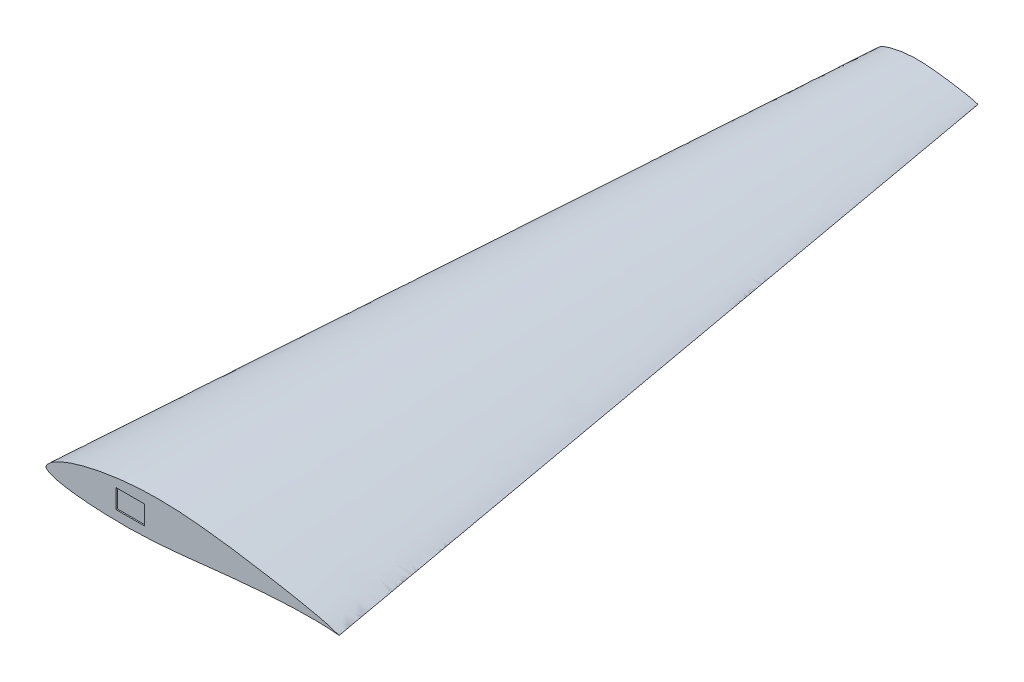
ISO-10303-21;
HEADER;
FILE_DESCRIPTION(('STEP AP214'),'2;1');
FILE_NAME('part.step','',(''),(''),'','','');
FILE_SCHEMA(('AUTOMOTIVE_DESIGN { 1 0 10303 214 1 1 1 1 }'));
ENDSEC;
DATA;
#1=APPLICATION_CONTEXT('core data for automotive mechanical design processes');
#2=APPLICATION_PROTOCOL_DEFINITION('international standard','automotive_design',2000,#1);
#3=PRODUCT_CONTEXT('',#1,'mechanical');
#4=PRODUCT('Part','Part','',(#3));
#5=PRODUCT_RELATED_PRODUCT_CATEGORY('part','',(#4));
#6=PRODUCT_DEFINITION_FORMATION('','',#4);
#7=PRODUCT_DEFINITION_CONTEXT('part definition',#1,'design');
#8=PRODUCT_DEFINITION('design','',#6,#7);
#9=PRODUCT_DEFINITION_SHAPE('','',#8);
#10=(LENGTH_UNIT() NAMED_UNIT(*) SI_UNIT(.MILLI.,.METRE.));
#11=(NAMED_UNIT(*) PLANE_ANGLE_UNIT() SI_UNIT($,.RADIAN.));
#12=(NAMED_UNIT(*) SI_UNIT($,.STERADIAN.) SOLID_ANGLE_UNIT());
#13=UNCERTAINTY_MEASURE_WITH_UNIT(LENGTH_MEASURE(1.E-05),#10,'distance_accuracy_value','');
#14=(GEOMETRIC_REPRESENTATION_CONTEXT(3) GLOBAL_UNCERTAINTY_ASSIGNED_CONTEXT((#13)) GLOBAL_UNIT_ASSIGNED_CONTEXT((#10,
#11,#12)) REPRESENTATION_CONTEXT('',''));
#15=CARTESIAN_POINT('',(0.,0.,0.));
#16=DIRECTION('',(0.,0.,1.));
#17=DIRECTION('',(1.,0.,0.));
#18=AXIS2_PLACEMENT_3D('',#15,#16,#17);
#19=CARTESIAN_POINT('',(-1152.13318667176,-13.10991310776,-20.));
#20=DIRECTION('',(0.,0.,1.));
#21=DIRECTION('',(-1.,0.,0.));
#22=AXIS2_PLACEMENT_3D('',#19,#20,#21);
#23=PLANE('',#22);
#24=CARTESIAN_POINT('',(1167.2058981927,-30.8287655417814,-20.));
#25=CARTESIAN_POINT('',(1167.20094205409,-30.6125348061449,-20.));
#26=CARTESIAN_POINT('',(1150.55812547847,-26.2222684266974,-20.));
#27=CARTESIAN_POINT('',(1134.82540200827,-19.935632175429,-20.));
#28=CARTESIAN_POINT('',(1098.6120870386,-7.58308667640115,-20.));
#29=CARTESIAN_POINT('',(1055.10846288295,5.30202759492293,-20.));
#30=CARTESIAN_POINT('',(998.763315338816,18.7180818982876,-20.));
#31=CARTESIAN_POINT('',(932.135509290922,33.1471605686924,-20.));
#32=CARTESIAN_POINT('',(855.136774910614,48.7571140419909,-20.));
#33=CARTESIAN_POINT('',(769.160433794038,65.3150377322802,-20.));
#34=CARTESIAN_POINT('',(675.329726698728,82.5389939377325,-20.));
#35=CARTESIAN_POINT('',(574.985519526962,100.129820104777,-20.));
#36=CARTESIAN_POINT('',(469.432133283733,117.589571827369,-20.));
#37=CARTESIAN_POINT('',(360.059319501105,134.510811557431,-20.));
#38=CARTESIAN_POINT('',(248.195538752362,150.341358991376,-20.));
#39=CARTESIAN_POINT('',(135.170092557183,164.471008346329,-20.));
#40=CARTESIAN_POINT('',(22.2510450991397,176.387001607296,-20.));
#41=CARTESIAN_POINT('',(-89.4773105438022,185.36142647281,-20.));
#42=CARTESIAN_POINT('',(-199.198140394845,190.447965807139,-20.));
#43=CARTESIAN_POINT('',(-306.290633386234,191.360736000371,-20.));
#44=CARTESIAN_POINT('',(-410.303508399844,187.860956850583,-20.));
#45=CARTESIAN_POINT('',(-510.728758861772,180.174517107883,-20.));
#46=CARTESIAN_POINT('',(-606.924129786052,169.079400162372,-20.));
#47=CARTESIAN_POINT('',(-698.060056527238,155.258673151785,-20.));
#48=CARTESIAN_POINT('',(-783.165410093493,138.967899254407,-20.));
#49=CARTESIAN_POINT('',(-861.372011698718,120.724870890821,-20.));
#50=CARTESIAN_POINT('',(-931.876852978271,100.923653640039,-20.));
#51=CARTESIAN_POINT('',(-993.926503002303,80.0008743940595,-20.));
#52=CARTESIAN_POINT('',(-1046.91523960918,58.4337335558672,-20.));
#53=CARTESIAN_POINT('',(-1090.33210191695,36.5317821888165,-20.));
#54=CARTESIAN_POINT('',(-1123.8026712494,14.8406154016031,-20.));
#55=CARTESIAN_POINT('',(-1143.08475254185,-2.09839090037191,-20.));
#56=CARTESIAN_POINT('',(-1153.7633419372,-14.9763351096262,-20.));
#57=CARTESIAN_POINT('',(-1158.68703654053,-22.3942325025825,-20.));
#58=CARTESIAN_POINT('',(-1162.00980127258,-30.3470028754014,-20.));
#59=CARTESIAN_POINT('',(-1162.96321031832,-35.2319349474596,-20.));
#60=CARTESIAN_POINT('',(-1162.78139542472,-38.6557944007734,-20.));
#61=CARTESIAN_POINT('',(-1161.40716590262,-41.8760675021992,-20.));
#62=CARTESIAN_POINT('',(-1158.19651173585,-46.0146296484932,-20.));
#63=CARTESIAN_POINT('',(-1151.34910308779,-52.3047930563116,-20.));
#64=CARTESIAN_POINT('',(-1137.77118638329,-61.0452534655465,-20.));
#65=CARTESIAN_POINT('',(-1112.70761372977,-72.0855309303668,-20.));
#66=CARTESIAN_POINT('',(-1074.56858735021,-83.6296075048392,-20.));
#67=CARTESIAN_POINT('',(-1023.37735058653,-94.5175934332822,-20.));
#68=CARTESIAN_POINT('',(-961.357944689747,-103.965687711033,-20.));
#69=CARTESIAN_POINT('',(-889.205864982308,-112.148705326003,-20.));
#70=CARTESIAN_POINT('',(-807.781230762513,-118.864291993696,-20.));
#71=CARTESIAN_POINT('',(-718.123012274133,-123.92113901691,-20.));
#72=CARTESIAN_POINT('',(-621.353030363154,-127.121085721016,-20.));
#73=CARTESIAN_POINT('',(-518.513635114154,-128.000687141774,-20.));
#74=CARTESIAN_POINT('',(-410.4965568004,-125.92739470241,-20.));
#75=CARTESIAN_POINT('',(-297.931780603609,-120.499713058915,-20.));
#76=CARTESIAN_POINT('',(-181.192228331441,-111.413060940735,-20.));
#77=CARTESIAN_POINT('',(-60.6773192350566,-99.1751483002546,-20.));
#78=CARTESIAN_POINT('',(62.9269886556645,-85.6192218943303,-20.));
#79=CARTESIAN_POINT('',(188.252653618113,-71.7895767046168,-20.));
#80=CARTESIAN_POINT('',(313.535108762903,-58.6199136567897,-20.));
#81=CARTESIAN_POINT('',(436.892194820228,-46.7059926617858,-20.));
#82=CARTESIAN_POINT('',(556.377817264392,-36.7171224297439,-20.));
#83=CARTESIAN_POINT('',(670.014090312546,-28.9740748515905,-20.));
#84=CARTESIAN_POINT('',(775.805069390217,-23.5991733728416,-20.));
#85=CARTESIAN_POINT('',(871.995923235459,-20.7419146039119,-20.));
#86=CARTESIAN_POINT('',(956.449753180622,-19.9967327290336,-20.));
#87=CARTESIAN_POINT('',(1028.67553891412,-21.2747573154828,-20.));
#88=CARTESIAN_POINT('',(1084.37445965471,-23.2358309601832,-20.));
#89=CARTESIAN_POINT('',(1129.92046876616,-26.8606596821739,-20.));
#90=CARTESIAN_POINT('',(1148.77840735508,-27.9769839768032,-20.));
#91=CARTESIAN_POINT('',(1167.21101773133,-31.0521252358525,-20.));
#92=CARTESIAN_POINT('',(1167.2058981927,-30.8287655417814,-20.));
#93=B_SPLINE_CURVE_WITH_KNOTS('',3,(#24,#25,#26,#27,#28,#29,#30,#31,#32,#33,#34,#35,#36,#37,#38,
#39,#40,#41,#42,#43,#44,#45,#46,#47,#48,#49,#50,#51,#52,#53,#54,#55,#56,#57,#58,#59,#60,#61,#62,
#63,#64,#65,#66,#67,#68,#69,#70,#71,#72,#73,#74,#75,#76,#77,#78,#79,#80,#81,#82,#83,#84,#85,#86,
#87,#88,#89,#90,#91,#92),.UNSPECIFIED.,.T.,.F.,(4,1,1,1,1,1,1,1,1,1,1,1,1,1,1,1,1,1,1,1,1,1,1,1,
1,1,1,1,1,1,1,1,1,1,1,1,1,1,1,1,1,1,1,1,1,1,1,1,1,1,1,1,1,1,1,1,1,1,1,1,1,1,1,1,1,1,4),(0.,
0.00178025429931348,0.00677661855276226,0.014307631931115,0.0240462466109695,0.0361164032384218,
0.0505469730630571,0.0671298835400742,0.0856244289456062,0.10576729194862,0.127282098412942,
0.149864114045041,0.173229760189317,0.197069077892929,0.221103034083199,0.245051957369849,
0.268663179942347,0.291772797822348,0.314298508345449,0.336177511433891,0.357377359215959,
0.377791670496789,0.397224888102935,0.415489312865215,0.432417328029751,0.447849235180273,
0.461650757544391,0.473686992386839,0.483898395757803,0.492262508108233,0.498796820958936,
0.499955027372734,0.502810607326279,0.504371243067385,0.50535998755193,0.505924933279694,
0.506503368203689,0.507535007041587,0.509204749770686,0.512345281497249,0.517665407870953,
0.526421681932562,0.537424925562334,0.550643204547595,0.565965823835836,0.583206168779579,
0.6021549785986,0.622586582637333,0.644254823208852,0.666997978581174,0.690702845759673,
0.715307475272001,0.740824202204505,0.767084355637659,0.793717038600972,0.82033109971691,
0.846519300878587,0.871863223081629,0.895937170924907,0.918334876492831,0.938667169413558,
0.956573464196435,0.971715275283217,0.983839006179547,0.992717916559063,0.998161052107173,1.),.UNSPECIFIED.);
#94=CARTESIAN_POINT('',(1167.2058981927,-30.8287655417814,-20.));
#95=VERTEX_POINT('',#94);
#96=EDGE_CURVE('E63',#95,#95,#93,.T.);
#97=ORIENTED_EDGE('',*,*,#96,.T.);
#98=EDGE_LOOP('',(#97));
#99=FACE_BOUND('',#98,.T.);
#100=DIRECTION('',(-1.,0.,0.));
#101=VECTOR('',#100,1.);
#102=CARTESIAN_POINT('',(-378.662123766315,-50.9305698518282,-20.));
#103=LINE('',#102,#101);
#104=CARTESIAN_POINT('',(-378.662123766315,-50.9305698518282,-20.));
#105=VERTEX_POINT('',#104);
#106=CARTESIAN_POINT('',(-605.033690274723,-50.9305698518282,-20.));
#107=VERTEX_POINT('',#106);
#108=EDGE_CURVE('E101',#105,#107,#103,.T.);
#109=ORIENTED_EDGE('',*,*,#108,.T.);
#110=DIRECTION('',(0.,1.,0.));
#111=VECTOR('',#110,1.);
#112=CARTESIAN_POINT('',(-605.033690274723,100.87153945381,-20.));
#113=LINE('',#112,#111);
#114=CARTESIAN_POINT('',(-605.033690274723,100.87153945381,-20.));
#115=VERTEX_POINT('',#114);
#116=EDGE_CURVE('E78',#107,#115,#113,.T.);
#117=ORIENTED_EDGE('',*,*,#116,.T.);
#118=DIRECTION('',(1.,0.,0.));
#119=VECTOR('',#118,1.);
#120=CARTESIAN_POINT('',(-378.662123766315,100.87153945381,-20.));
#121=LINE('',#120,#119);
#122=CARTESIAN_POINT('',(-378.662123766315,100.87153945381,-20.));
#123=VERTEX_POINT('',#122);
#124=EDGE_CURVE('E141',#115,#123,#121,.T.);
#125=ORIENTED_EDGE('',*,*,#124,.T.);
#126=DIRECTION('',(0.,-1.,0.));
#127=VECTOR('',#126,1.);
#128=CARTESIAN_POINT('',(-378.662123766315,100.87153945381,-20.));
#129=LINE('',#128,#127);
#130=EDGE_CURVE('E129',#123,#105,#129,.T.);
#131=ORIENTED_EDGE('',*,*,#130,.T.);
#132=EDGE_LOOP('',(#109,#117,#125,#131));
#133=FACE_BOUND('',#132,.T.);
#134=ADVANCED_FACE('F50',(#99,#133),#23,.T.);
#135=CARTESIAN_POINT('',(-747.653077521207,-40.6182657315667,-6220.));
#136=DIRECTION('',(0.,0.,1.));
#137=DIRECTION('',(-1.,0.,0.));
#138=AXIS2_PLACEMENT_3D('',#135,#136,#137);
#139=PLANE('',#138);
#140=CARTESIAN_POINT('',(46.231204019507,-35.2354448345607,-6220.));
#141=CARTESIAN_POINT('',(46.2284405656363,-35.161464044046,-6220.));
#142=CARTESIAN_POINT('',(40.5107466597847,-33.7410304315181,-6220.));
#143=CARTESIAN_POINT('',(35.095173755005,-31.6670699807893,-6220.));
#144=CARTESIAN_POINT('',(22.6401533138637,-27.6181263346662,-6220.));
#145=CARTESIAN_POINT('',(7.68738653694873,-23.4228917248776,-6220.));
#146=CARTESIAN_POINT('',(-11.6630288456523,-19.1093216631822,-6220.));
#147=CARTESIAN_POINT('',(-34.5376973183015,-14.4997928532483,-6220.));
#148=CARTESIAN_POINT('',(-60.9676577726097,-9.5372939208794,-6220.));
#149=CARTESIAN_POINT('',(-90.4748945702333,-4.29466001199642,-6220.));
#150=CARTESIAN_POINT('',(-122.673585589033,1.13715909285272,-6220.));
#151=CARTESIAN_POINT('',(-157.103341203516,6.66239247620247,-6220.));
#152=CARTESIAN_POINT('',(-193.315298237174,12.1170555043395,-6220.));
#153=CARTESIAN_POINT('',(-230.831801501577,17.3685612770775,-6220.));
#154=CARTESIAN_POINT('',(-269.195458339637,22.2344819950382,-6220.));
#155=CARTESIAN_POINT('',(-307.948301893932,26.5125347132972,-6220.));
#156=CARTESIAN_POINT('',(-346.653804819708,30.0334858752315,-6220.));
#157=CARTESIAN_POINT('',(-384.937273776908,32.5535580846316,-6220.));
#158=CARTESIAN_POINT('',(-422.514475712798,33.7529045585345,-6220.));
#159=CARTESIAN_POINT('',(-459.17152624748,33.5367452774346,-6220.));
#160=CARTESIAN_POINT('',(-494.752795326995,31.8255847079449,-6220.));
#161=CARTESIAN_POINT('',(-529.085531914352,28.6992408412461,-6220.));
#162=CARTESIAN_POINT('',(-561.953763146873,24.4271493642645,-6220.));
#163=CARTESIAN_POINT('',(-593.076940726259,19.2471852213284,-6220.));
#164=CARTESIAN_POINT('',(-622.123955821754,13.2516082607377,-6220.));
#165=CARTESIAN_POINT('',(-648.800228679982,6.62191851956731,-6220.));
#166=CARTESIAN_POINT('',(-672.832873554333,-0.503051287442359,-6220.));
#167=CARTESIAN_POINT('',(-693.96618270177,-7.97014647053786,-6220.));
#168=CARTESIAN_POINT('',(-711.995202148996,-15.6130550209624,-6220.));
#169=CARTESIAN_POINT('',(-726.74658265942,-23.3233108305785,-6220.));
#170=CARTESIAN_POINT('',(-738.094871742379,-30.9123353139702,-6220.));
#171=CARTESIAN_POINT('',(-744.610586604553,-36.8048992419908,-6220.));
#172=CARTESIAN_POINT('',(-748.201788544685,-41.2650967461758,-6220.));
#173=CARTESIAN_POINT('',(-749.850318344285,-43.828182757875,-6220.));
#174=CARTESIAN_POINT('',(-750.94828793429,-46.5664283398626,-6220.));
#175=CARTESIAN_POINT('',(-751.250483793828,-48.2430082792743,-6220.));
#176=CARTESIAN_POINT('',(-751.171358916499,-49.4139312981977,-6220.));
#177=CARTESIAN_POINT('',(-750.685133378202,-50.5092914480428,-6220.));
#178=CARTESIAN_POINT('',(-749.565856882824,-51.9098735302076,-6220.));
#179=CARTESIAN_POINT('',(-747.191277168439,-54.0288947151431,-6220.));
#180=CARTESIAN_POINT('',(-742.501078818877,-56.9533147580623,-6220.));
#181=CARTESIAN_POINT('',(-733.868548954772,-60.6081626209987,-6220.));
#182=CARTESIAN_POINT('',(-720.75844147582,-64.3709023541952,-6220.));
#183=CARTESIAN_POINT('',(-703.184436093652,-67.8446748921428,-6220.));
#184=CARTESIAN_POINT('',(-681.911582287878,-70.772200095514,-6220.));
#185=CARTESIAN_POINT('',(-657.177051439535,-73.2167412462913,-6220.));
#186=CARTESIAN_POINT('',(-629.276219223052,-75.1132874538173,-6220.));
#187=CARTESIAN_POINT('',(-598.56561876685,-76.4014909147392,-6220.));
#188=CARTESIAN_POINT('',(-565.43017274413,-77.0190676374616,-6220.));
#189=CARTESIAN_POINT('',(-530.228914169513,-76.8125475071701,-6220.));
#190=CARTESIAN_POINT('',(-493.270160843118,-75.5698410912889,-6220.));
#191=CARTESIAN_POINT('',(-454.771507600199,-73.1566453823038,-6220.));
#192=CARTESIAN_POINT('',(-414.862090680234,-69.4705576020164,-6220.));
#193=CARTESIAN_POINT('',(-373.676106035862,-64.6873134822189,-6220.));
#194=CARTESIAN_POINT('',(-331.439275690689,-59.4377296716919,-6220.));
#195=CARTESIAN_POINT('',(-288.614659582081,-54.0859694749774,-6220.));
#196=CARTESIAN_POINT('',(-245.801574741511,-48.9603022904963,-6220.));
#197=CARTESIAN_POINT('',(-203.641252257449,-44.2739171415237,-6220.));
#198=CARTESIAN_POINT('',(-162.796442142331,-40.2654907769843,-6220.));
#199=CARTESIAN_POINT('',(-123.942495214821,-37.0545696704387,-6220.));
#200=CARTESIAN_POINT('',(-87.7619223828843,-34.6928701852552,-6220.));
#201=CARTESIAN_POINT('',(-54.8545790950461,-33.2402187187982,-6220.));
#202=CARTESIAN_POINT('',(-25.9538233844276,-32.5683565258773,-6220.));
#203=CARTESIAN_POINT('',(-1.22814621466564,-32.6492910205264,-6220.));
#204=CARTESIAN_POINT('',(17.844561028956,-33.0455684548176,-6220.));
#205=CARTESIAN_POINT('',(33.4506324915198,-34.0613780335465,-6220.));
#206=CARTESIAN_POINT('',(39.9102962245878,-34.3503679361492,-6220.));
#207=CARTESIAN_POINT('',(46.2340585822929,-35.311864713945,-6220.));
#208=CARTESIAN_POINT('',(46.231204019507,-35.2354448345607,-6220.));
#209=B_SPLINE_CURVE_WITH_KNOTS('',3,(#140,#141,#142,#143,#144,#145,#146,#147,#148,#149,#150,
#151,#152,#153,#154,#155,#156,#157,#158,#159,#160,#161,#162,#163,#164,#165,#166,#167,#168,#169,
#170,#171,#172,#173,#174,#175,#176,#177,#178,#179,#180,#181,#182,#183,#184,#185,#186,#187,#188,
#189,#190,#191,#192,#193,#194,#195,#196,#197,#198,#199,#200,#201,#202,#203,#204,#205,#206,#207,
#208),.UNSPECIFIED.,.T.,.F.,(4,1,1,1,1,1,1,1,1,1,1,1,1,1,1,1,1,1,1,1,1,1,1,1,1,1,1,1,1,1,1,1,1,
1,1,1,1,1,1,1,1,1,1,1,1,1,1,1,1,1,1,1,1,1,1,1,1,1,1,1,1,1,1,1,1,1,4),(0.,0.00178025429931348,
0.00677661855276226,0.014307631931115,0.0240462466109695,0.0361164032384218,0.0505469730630571,
0.0671298835400742,0.0856244289456062,0.10576729194862,0.127282098412942,0.149864114045041,
0.173229760189317,0.197069077892929,0.221103034083199,0.245051957369849,0.268663179942347,
0.291772797822348,0.314298508345449,0.336177511433891,0.357377359215959,0.377791670496789,
0.397224888102935,0.415489312865215,0.432417328029751,0.447849235180273,0.461650757544391,
0.473686992386839,0.483898395757803,0.492262508108233,0.498796820958936,0.499955027372734,
0.502810607326279,0.504371243067385,0.50535998755193,0.505924933279694,0.506503368203689,
0.507535007041587,0.509204749770686,0.512345281497249,0.517665407870953,0.526421681932562,
0.537424925562334,0.550643204547595,0.565965823835836,0.583206168779579,0.6021549785986,
0.622586582637333,0.644254823208852,0.666997978581174,0.690702845759673,0.715307475272001,
0.740824202204505,0.767084355637659,0.793717038600972,0.82033109971691,0.846519300878587,
0.871863223081629,0.895937170924907,0.918334876492831,0.938667169413558,0.956573464196435,
0.971715275283217,0.983839006179547,0.992717916559063,0.998161052107173,1.),.UNSPECIFIED.);
#210=CARTESIAN_POINT('',(46.231204019507,-35.2354448345607,-6220.));
#211=VERTEX_POINT('',#210);
#212=EDGE_CURVE('E12',#211,#211,#209,.T.);
#213=ORIENTED_EDGE('',*,*,#212,.F.);
#214=EDGE_LOOP('',(#213));
#215=FACE_BOUND('',#214,.T.);
#216=ADVANCED_FACE('F52',(#215),#139,.F.);
#217=CARTESIAN_POINT('',(-1162.80093681062,-35.1631921790562,-20.));
#218=CARTESIAN_POINT('',(-751.127407137551,-47.6464509229914,-6220.));
#219=CARTESIAN_POINT('',(-1162.82218379801,-35.4148684875712,-20.));
#220=CARTESIAN_POINT('',(-751.14142513213,-47.7317010378396,-6220.));
#221=CARTESIAN_POINT('',(-1162.87189893173,-36.2284220161607,-20.));
#222=CARTESIAN_POINT('',(-751.181479745274,-48.0073492187059,-6220.));
#223=CARTESIAN_POINT('',(-1162.84876824659,-37.3870585535843,-20.));
#224=CARTESIAN_POINT('',(-751.212003010877,-48.4002126372902,-6220.));
#225=CARTESIAN_POINT('',(-1162.61538645023,-38.8260829593911,-20.));
#226=CARTESIAN_POINT('',(-751.205936581557,-48.9022365528266,-6220.));
#227=CARTESIAN_POINT('',(-1162.20122176191,-40.0153326805554,-20.));
#228=CARTESIAN_POINT('',(-751.149350948429,-49.3294659917411,-6220.));
#229=CARTESIAN_POINT('',(-1161.5415607564,-41.3501189108856,-20.));
#230=CARTESIAN_POINT('',(-750.994737816625,-49.8118201361654,-6220.));
#231=CARTESIAN_POINT('',(-1160.49507255786,-43.0517640407889,-20.));
#232=CARTESIAN_POINT('',(-750.693102250106,-50.4312829941758,-6220.));
#233=CARTESIAN_POINT('',(-1159.10433634,-44.7657984056075,-20.));
#234=CARTESIAN_POINT('',(-750.256246487288,-51.0459696479064,-6220.));
#235=CARTESIAN_POINT('',(-1156.5731933585,-47.5058416355701,-20.));
#236=CARTESIAN_POINT('',(-749.416488376659,-52.0107554517047,-6220.));
#237=CARTESIAN_POINT('',(-1154.1769500547,-49.6523307730814,-20.));
#238=CARTESIAN_POINT('',(-748.611427802237,-52.7615844367858,-6220.));
#239=CARTESIAN_POINT('',(-1148.6375824423,-54.0502698747751,-20.));
#240=CARTESIAN_POINT('',(-746.730863479948,-54.2879264972246,-6220.));
#241=CARTESIAN_POINT('',(-1143.93790078237,-57.0324125459158,-20.));
#242=CARTESIAN_POINT('',(-745.127778881206,-55.3155216976197,-6220.));
#243=CARTESIAN_POINT('',(-1132.68502689756,-63.2856607980921,-20.));
#244=CARTESIAN_POINT('',(-741.271616253597,-57.4518931681089,-6220.));
#245=CARTESIAN_POINT('',(-1124.41666857986,-66.8979562011114,-20.));
#246=CARTESIAN_POINT('',(-738.436071417425,-58.6743610617412,-6220.));
#247=CARTESIAN_POINT('',(-1104.0799315644,-74.6969930737921,-20.));
#248=CARTESIAN_POINT('',(-731.452005928495,-61.2861024299933,-6220.));
#249=CARTESIAN_POINT('',(-1090.22169978196,-78.8689057909252,-20.));
#250=CARTESIAN_POINT('',(-726.694952758834,-62.6670607253582,-6220.));
#251=CARTESIAN_POINT('',(-1060.4278402018,-86.6372366559048,-20.));
#252=CARTESIAN_POINT('',(-716.466679165266,-65.2097515079323,-6220.));
#253=CARTESIAN_POINT('',(-1042.79647444445,-90.3716143825966,-20.));
#254=CARTESIAN_POINT('',(-710.416790483915,-66.4150887779212,-6220.));
#255=CARTESIAN_POINT('',(-1005.56620474238,-97.230960043249,-20.));
#256=CARTESIAN_POINT('',(-697.644342595635,-68.6007561784582,-6220.));
#257=CARTESIAN_POINT('',(-984.279801732776,-100.463443592199,-20.));
#258=CARTESIAN_POINT('',(-690.344479221008,-69.6116826334672,-6220.));
#259=CARTESIAN_POINT('',(-939.968877173729,-106.391496044778,-20.));
#260=CARTESIAN_POINT('',(-675.151371615518,-71.4362702565338,-6220.));
#261=CARTESIAN_POINT('',(-915.262534533087,-109.185210548054,-20.));
#262=CARTESIAN_POINT('',(-666.682488130611,-72.2773083825788,-6220.));
#263=CARTESIAN_POINT('',(-864.426937652912,-114.192374734008,-20.));
#264=CARTESIAN_POINT('',(-649.260178746018,-73.7517046735597,-6220.));
#265=CARTESIAN_POINT('',(-836.616183644671,-116.479005488935,-20.));
#266=CARTESIAN_POINT('',(-639.73101548564,-74.4026274975686,-6220.));
#267=CARTESIAN_POINT('',(-779.921918043632,-120.435595606086,-20.));
#268=CARTESIAN_POINT('',(-620.308326956115,-75.486802895482,-6220.));
#269=CARTESIAN_POINT('',(-749.356989548695,-122.153094567043,-20.));
#270=CARTESIAN_POINT('',(-609.839170905086,-75.9286043978483,-6220.));
#271=CARTESIAN_POINT('',(-687.526671639854,-124.932885195187,-20.));
#272=CARTESIAN_POINT('',(-588.664210241904,-76.5836753733088,-6220.));
#273=CARTESIAN_POINT('',(-654.579763498405,-126.015577223397,-20.));
#274=CARTESIAN_POINT('',(-577.382832209052,-76.7962945908848,-6220.));
#275=CARTESIAN_POINT('',(-588.388676330774,-127.40303499319,-20.));
#276=CARTESIAN_POINT('',(-554.722067026049,-76.9537868757262,-6220.));
#277=CARTESIAN_POINT('',(-553.463082381829,-127.694050613575,-20.));
#278=CARTESIAN_POINT('',(-542.767268643542,-76.8861080190515,-6220.));
#279=CARTESIAN_POINT('',(-483.592413040276,-127.330405119437,-20.));
#280=CARTESIAN_POINT('',(-518.85553536317,-76.4273586963049,-6220.));
#281=CARTESIAN_POINT('',(-446.966886676244,-126.619332334349,-20.));
#282=CARTESIAN_POINT('',(-506.323726287629,-76.00875604561,-6220.));
#283=CARTESIAN_POINT('',(-373.906113490436,-124.163065893781,-20.));
#284=CARTESIAN_POINT('',(-481.330177815911,-74.8185266368609,-6220.));
#285=CARTESIAN_POINT('',(-335.792606005059,-122.317057011245,-20.));
#286=CARTESIAN_POINT('',(-468.294534369807,-74.0043038696539,-6220.));
#287=CARTESIAN_POINT('',(-259.889195452736,-117.538593796299,-20.));
#288=CARTESIAN_POINT('',(-442.339202583138,-72.0054456539621,-6220.));
#289=CARTESIAN_POINT('',(-220.424449688419,-114.460196449742,-20.));
#290=CARTESIAN_POINT('',(-428.847066353092,-70.7622288894901,-6220.));
#291=CARTESIAN_POINT('',(-141.813544032135,-107.414278533103,-20.));
#292=CARTESIAN_POINT('',(-401.976193920792,-67.9716757541424,-6220.));
#293=CARTESIAN_POINT('',(-100.995999182059,-103.26712330858,-20.));
#294=CARTESIAN_POINT('',(-388.026457907883,-66.3539298518788,-6220.));
#295=CARTESIAN_POINT('',(-19.8959729918267,-94.7025782269162,-20.));
#296=CARTESIAN_POINT('',(-360.311756195002,-63.0254702980006,-6220.));
#297=CARTESIAN_POINT('',(22.0572868382875,-90.1012921926885,-20.));
#298=CARTESIAN_POINT('',(-345.97580160877,-61.2444635221544,-6220.));
#299=CARTESIAN_POINT('',(104.877431201199,-80.9900045976973,-20.));
#300=CARTESIAN_POINT('',(-317.67543865908,-57.7176072400212,-6220.));
#301=CARTESIAN_POINT('',(147.415245349056,-76.2974479994419,-20.));
#302=CARTESIAN_POINT('',(-303.140030241952,-55.9011941659093,-6220.));
#303=CARTESIAN_POINT('',(230.814160738487,-67.3155208048084,-20.));
#304=CARTESIAN_POINT('',(-274.641213520155,-52.4135466090698,-6220.));
#305=CARTESIAN_POINT('',(273.34654561888,-62.8469584398096,-20.));
#306=CARTESIAN_POINT('',(-260.106661836917,-50.6729356073692,-6220.));
#307=CARTESIAN_POINT('',(356.10424868016,-54.5085538151363,-20.));
#308=CARTESIAN_POINT('',(-231.824260001459,-47.4074556833747,-6220.));
#309=CARTESIAN_POINT('',(398.001483145769,-50.4658204194294,-20.));
#310=CARTESIAN_POINT('',(-217.505056961184,-45.8149662759653,-6220.));
#311=CARTESIAN_POINT('',(478.837616492646,-43.1994002756613,-20.));
#312=CARTESIAN_POINT('',(-189.875157787999,-42.9241781081205,-6220.));
#313=CARTESIAN_POINT('',(519.449125211496,-39.808815896065,-20.));
#314=CARTESIAN_POINT('',(-175.992823604059,-41.5605567405333,-6220.));
#315=CARTESIAN_POINT('',(597.039432074497,-33.9464858219613,-20.));
#316=CARTESIAN_POINT('',(-149.466929054913,-39.1653912946596,-6220.));
#317=CARTESIAN_POINT('',(635.691758147447,-31.3178571213149,-20.));
#318=CARTESIAN_POINT('',(-136.251337683896,-38.0717822114152,-6220.));
#319=CARTESIAN_POINT('',(708.697181241306,-27.0087106546781,-20.));
#320=CARTESIAN_POINT('',(-111.286803426713,-36.2300900327708,-6220.));
#321=CARTESIAN_POINT('',(744.726286704508,-25.1844843466594,-20.));
#322=CARTESIAN_POINT('',(-98.9651052741872,-35.4241618480409,-6220.));
#323=CARTESIAN_POINT('',(811.896313393692,-22.5271169424411,-20.));
#324=CARTESIAN_POINT('',(-75.9899672258875,-34.1751701427918,-6220.));
#325=CARTESIAN_POINT('',(844.710262781509,-21.5587233449551,-20.));
#326=CARTESIAN_POINT('',(-64.7640727036485,-33.6776603042969,-6220.));
#327=CARTESIAN_POINT('',(904.722881392011,-20.4531469298585,-20.));
#328=CARTESIAN_POINT('',(-44.2292297655829,-32.9951221570591,-6220.));
#329=CARTESIAN_POINT('',(933.614915270421,-20.2064937713281,-20.));
#330=CARTESIAN_POINT('',(-34.3430563613789,-32.763382860872,-6220.));
#331=CARTESIAN_POINT('',(985.645245963093,-20.5133426517996,-20.));
#332=CARTESIAN_POINT('',(-16.5382582317236,-32.6015550028647,-6220.));
#333=CARTESIAN_POINT('',(1010.40894688517,-20.9569515974464,-20.));
#334=CARTESIAN_POINT('',(-8.05769346037086,-32.6269358813236,-6220.));
#335=CARTESIAN_POINT('',(1052.55365181706,-22.1154690793108,-20.));
#336=CARTESIAN_POINT('',(6.38583708555751,-32.8090373118029,-6220.));
#337=CARTESIAN_POINT('',(1071.81891508838,-22.8098110488612,-20.));
#338=CARTESIAN_POINT('',(12.9729042702342,-32.9443490727743,-6220.));
#339=CARTESIAN_POINT('',(1105.86292841497,-24.9460141413969,-20.));
#340=CARTESIAN_POINT('',(24.5916797934128,-33.4883744378349,-6220.));
#341=CARTESIAN_POINT('',(1121.63655147603,-26.1959565127779,-20.));
#342=CARTESIAN_POINT('',(30.03006042549,-33.8387307210732,-6220.));
#343=CARTESIAN_POINT('',(1140.69335667294,-27.4983771313504,-20.));
#344=CARTESIAN_POINT('',(36.6899311496249,-34.2045790935945,-6220.));
#345=CARTESIAN_POINT('',(1147.84079960988,-27.9981008544572,-20.));
#346=CARTESIAN_POINT('',(39.0340366974602,-34.3111661810945,-6220.));
#347=CARTESIAN_POINT('',(1163.45052073251,-30.42475563168,-20.));
#348=CARTESIAN_POINT('',(44.0733446394874,-34.9879008816027,-6220.));
#349=CARTESIAN_POINT('',(1167.93232742973,-31.1215007100377,-20.));
#350=CARTESIAN_POINT('',(45.9272473515707,-35.2652155843534,-6220.));
#351=CARTESIAN_POINT('',(1166.33325094202,-30.3836435544886,-20.));
#352=CARTESIAN_POINT('',(46.4680358961861,-35.2384187687712,-6220.));
#353=CARTESIAN_POINT('',(1161.2442722409,-29.024594269748,-20.));
#354=CARTESIAN_POINT('',(45.0244696021425,-34.8623642927802,-6220.));
#355=CARTESIAN_POINT('',(1148.2120545959,-25.2848023683636,-20.));
#356=CARTESIAN_POINT('',(40.2341206243334,-33.6034333426219,-6220.));
#357=CARTESIAN_POINT('',(1142.25005771613,-22.916800229585,-20.));
#358=CARTESIAN_POINT('',(38.0794627096275,-32.8099402503357,-6220.));
#359=CARTESIAN_POINT('',(1126.12472065244,-16.96778561373,-20.));
#360=CARTESIAN_POINT('',(32.6553805949656,-30.8788003993694,-6220.));
#361=CARTESIAN_POINT('',(1113.32486640781,-12.6124338111884,-20.));
#362=CARTESIAN_POINT('',(28.2853129879629,-29.453284574816,-6220.));
#363=CARTESIAN_POINT('',(1086.92159636149,-4.1205404820076,-20.));
#364=CARTESIAN_POINT('',(19.1724246219445,-26.6503419030121,-6220.));
#365=CARTESIAN_POINT('',(1071.94600026188,0.300240411527605,-20.));
#366=CARTESIAN_POINT('',(14.0188966510992,-25.1992967714753,-6220.));
#367=CARTESIAN_POINT('',(1039.41748291533,9.03812641609774,-20.));
#368=CARTESIAN_POINT('',(2.85974978337416,-22.3526340151024,-6220.));
#369=CARTESIAN_POINT('',(1020.10278709425,13.6315317362294,-20.));
#370=CARTESIAN_POINT('',(-3.76900719014392,-20.8690469613892,-6220.));
#371=CARTESIAN_POINT('',(979.550729393399,22.878805933971,-20.));
#372=CARTESIAN_POINT('',(-17.6957510629968,-17.8959063334472,-6220.));
#373=CARTESIAN_POINT('',(956.686338927663,27.8267503564571,-20.));
#374=CARTESIAN_POINT('',(-25.5456443902167,-16.3118028101146,-6220.));
#375=CARTESIAN_POINT('',(909.142474659076,37.8085384952476,-20.));
#376=CARTESIAN_POINT('',(-41.8648224263828,-13.1254579178056,-6220.));
#377=CARTESIAN_POINT('',(882.801663806097,43.1459171622422,-20.));
#378=CARTESIAN_POINT('',(-50.9056937233297,-11.4265319293285,-6220.));
#379=CARTESIAN_POINT('',(828.767605392938,53.8354727041483,-20.));
#380=CARTESIAN_POINT('',(-69.4513275639072,-8.03099873418249,-6220.));
#381=CARTESIAN_POINT('',(799.421575983434,59.4847100989811,-20.));
#382=CARTESIAN_POINT('',(-79.5226702293248,-6.24057257240141,-6220.));
#383=CARTESIAN_POINT('',(739.759899581921,70.7119224980746,-20.));
#384=CARTESIAN_POINT('',(-99.9967162284235,-2.68925721914329,-6220.));
#385=CARTESIAN_POINT('',(707.787802745408,76.5786113767624,-20.));
#386=CARTESIAN_POINT('',(-110.967871891671,-0.837558427809834,-6220.));
#387=CARTESIAN_POINT('',(643.314129890749,88.1514833275713,-20.));
#388=CARTESIAN_POINT('',(-133.090718616217,2.8080684098029,-6220.));
#389=CARTESIAN_POINT('',(609.155063789181,94.1370211815367,-20.));
#390=CARTESIAN_POINT('',(-144.81097819915,4.6897332684965,-6220.));
#391=CARTESIAN_POINT('',(540.770148942646,105.789438396151,-20.));
#392=CARTESIAN_POINT('',(-168.272744518702,8.34388715992015,-6220.));
#393=CARTESIAN_POINT('',(504.884536405658,111.722376626192,-20.));
#394=CARTESIAN_POINT('',(-180.583631154224,10.1992648237815,-6220.));
#395=CARTESIAN_POINT('',(433.487022724113,123.150696314042,-20.));
#396=CARTESIAN_POINT('',(-205.075357182463,13.762168612102,-6220.));
#397=CARTESIAN_POINT('',(396.313239717191,128.898232320554,-20.));
#398=CARTESIAN_POINT('',(-217.82618550289,15.5480539922229,-6220.));
#399=CARTESIAN_POINT('',(322.814345929599,139.781582104013,-20.));
#400=CARTESIAN_POINT('',(-243.034336984895,18.9150117197281,-6220.));
#401=CARTESIAN_POINT('',(284.824972878614,145.153060385565,-20.));
#402=CARTESIAN_POINT('',(-256.062404549643,20.5687284200707,-6220.));
#403=CARTESIAN_POINT('',(210.123992235666,155.100796983355,-20.));
#404=CARTESIAN_POINT('',(-281.67727664949,23.6107968641405,-6220.));
#405=CARTESIAN_POINT('',(171.745512805084,159.893086791191,-20.));
#406=CARTESIAN_POINT('',(-294.835635649197,25.0649847446526,-6220.));
#407=CARTESIAN_POINT('',(96.70621955741,168.529980342407,-20.));
#408=CARTESIAN_POINT('',(-320.55981726333,27.6578998973982,-6220.));
#409=CARTESIAN_POINT('',(58.3757788906826,172.567678134436,-20.));
#410=CARTESIAN_POINT('',(-333.698000986181,28.8549260035531,-6220.));
#411=CARTESIAN_POINT('',(-16.1705938703289,179.473166351753,-20.));
#412=CARTESIAN_POINT('',(-359.244905506049,30.8598960825497,-6220.));
#413=CARTESIAN_POINT('',(-54.058965393001,182.506744355249,-20.));
#414=CARTESIAN_POINT('',(-372.226857307811,31.7168740487757,-6220.));
#415=CARTESIAN_POINT('',(-127.448992254084,187.121752683177,-20.));
#416=CARTESIAN_POINT('',(-397.366811804777,32.9470106612055,-6220.));
#417=CARTESIAN_POINT('',(-164.626196780766,188.834346007167,-20.));
#418=CARTESIAN_POINT('',(-410.098991871917,33.356641239308,-6220.));
#419=CARTESIAN_POINT('',(-236.415468718096,190.765176351186,-20.));
#420=CARTESIAN_POINT('',(-434.678287394496,33.6775423486159,-6220.));
#421=CARTESIAN_POINT('',(-272.706452706908,191.062320543712,-20.));
#422=CARTESIAN_POINT('',(-447.100446371808,33.6079260164729,-6220.));
#423=CARTESIAN_POINT('',(-342.564213532085,190.140218641669,-20.));
#424=CARTESIAN_POINT('',(-471.005220483377,32.9635913100783,-6220.));
#425=CARTESIAN_POINT('',(-377.81178064964,188.941854459652,-20.));
#426=CARTESIAN_POINT('',(-483.063233533356,32.3877545724089,-6220.));
#427=CARTESIAN_POINT('',(-445.46769240763,185.169528347952,-20.));
#428=CARTESIAN_POINT('',(-506.201080549589,30.7789828114937,-6220.));
#429=CARTESIAN_POINT('',(-479.556593177525,182.549213038335,-20.));
#430=CARTESIAN_POINT('',(-517.855832222937,29.7218188890459,-6220.));
#431=CARTESIAN_POINT('',(-544.691129780064,176.257317418702,-20.));
#432=CARTESIAN_POINT('',(-540.118788289106,27.2614685732158,-6220.));
#433=CARTESIAN_POINT('',(-577.414316944223,172.472558942099,-20.));
#434=CARTESIAN_POINT('',(-551.300593788726,25.8118090283584,-6220.));
#435=CARTESIAN_POINT('',(-639.493609112931,164.140251587825,-20.));
#436=CARTESIAN_POINT('',(-572.508172184002,22.6670900594036,-6220.));
#437=CARTESIAN_POINT('',(-670.522545440925,159.423235881507,-20.));
#438=CARTESIAN_POINT('',(-583.105791709451,20.9067263860822,-6220.));
#439=CARTESIAN_POINT('',(-728.886946080842,149.357823597283,-20.));
#440=CARTESIAN_POINT('',(-603.034084244006,17.1882015011721,-6220.));
#441=CARTESIAN_POINT('',(-757.890432247633,143.79392451745,-20.));
#442=CARTESIAN_POINT('',(-612.934669547302,15.1483633280053,-6220.));
#443=CARTESIAN_POINT('',(-811.926857081547,132.258799480076,-20.));
#444=CARTESIAN_POINT('',(-631.375133313428,10.948584902588,-6220.));
#445=CARTESIAN_POINT('',(-838.620463171783,126.018346935939,-20.));
#446=CARTESIAN_POINT('',(-640.482281189716,8.68912676252112,-6220.));
#447=CARTESIAN_POINT('',(-887.766697444238,113.311948639981,-20.));
#448=CARTESIAN_POINT('',(-657.244351257422,4.11413113065656,-6220.));
#449=CARTESIAN_POINT('',(-911.871750103956,106.525905964949,-20.));
#450=CARTESIAN_POINT('',(-665.463564111484,1.68173143428174,-6220.));
#451=CARTESIAN_POINT('',(-955.61019281655,92.9209101916263,-20.));
#452=CARTESIAN_POINT('',(-680.371919320127,-3.17190918195381,-6220.));
#453=CARTESIAN_POINT('',(-976.885714770049,85.7270645755306,-20.));
#454=CARTESIAN_POINT('',(-687.621764667123,-5.72845431454161,-6220.));
#455=CARTESIAN_POINT('',(-1014.73271526804,71.532461312736,-20.));
#456=CARTESIAN_POINT('',(-700.513224708011,-10.7517093635621,-6220.));
#457=CARTESIAN_POINT('',(-1032.93397620391,64.0971067527035,-20.));
#458=CARTESIAN_POINT('',(-706.711546363912,-13.3731939960453,-6220.));
#459=CARTESIAN_POINT('',(-1064.48741340707,49.5693229218913,-20.));
#460=CARTESIAN_POINT('',(-717.451731220248,-18.4733617403764,-6220.));
#461=CARTESIAN_POINT('',(-1079.45426749648,41.9807192724033,-20.));
#462=CARTESIAN_POINT('',(-722.545778818277,-21.1276334701891,-6220.));
#463=CARTESIAN_POINT('',(-1104.41450976715,27.4054403447282,-20.));
#464=CARTESIAN_POINT('',(-731.037271560184,-26.2043245006221,-6220.));
#465=CARTESIAN_POINT('',(-1116.00723379686,19.8353777408332,-20.));
#466=CARTESIAN_POINT('',(-734.98203913919,-28.8306679660894,-6220.));
#467=CARTESIAN_POINT('',(-1134.27124142093,5.64414052844726,-20.));
#468=CARTESIAN_POINT('',(-741.19471559795,-33.7331093397577,-6220.));
#469=CARTESIAN_POINT('',(-1142.48281019203,-1.67446842488961,-20.));
#470=CARTESIAN_POINT('',(-743.997220987845,-36.2501947799089,-6220.));
#471=CARTESIAN_POINT('',(-1150.05757817954,-10.5073348365584,-20.));
#472=CARTESIAN_POINT('',(-746.590147530688,-39.2729834142066,-6220.));
#473=CARTESIAN_POINT('',(-1151.57061250094,-12.3673196369903,-20.));
#474=CARTESIAN_POINT('',(-747.109292328489,-39.908239354684,-6220.));
#475=CARTESIAN_POINT('',(-1155.09840892185,-16.9877088244406,-20.));
#476=CARTESIAN_POINT('',(-748.32270500573,-41.4831737527192,-6220.));
#477=CARTESIAN_POINT('',(-1157.86377785403,-21.2938970643773,-20.));
#478=CARTESIAN_POINT('',(-749.284306226337,-42.9481636388296,-6220.));
#479=CARTESIAN_POINT('',(-1160.65973821963,-27.1157354475977,-20.));
#480=CARTESIAN_POINT('',(-750.272684648343,-44.9240560373193,-6220.));
#481=CARTESIAN_POINT('',(-1161.75449619331,-29.9576476035528,-20.));
#482=CARTESIAN_POINT('',(-750.675662256429,-45.8865223891553,-6220.));
#483=CARTESIAN_POINT('',(-1162.53487659342,-33.1037626602394,-20.));
#484=CARTESIAN_POINT('',(-750.98713472871,-46.9492209757362,-6220.));
#485=CARTESIAN_POINT('',(-1162.73719478688,-34.4081506789773,-20.));
#486=CARTESIAN_POINT('',(-751.085352453431,-47.3906963190849,-6220.));
#487=CARTESIAN_POINT('',(-1162.80093681062,-35.1631921790562,-20.));
#488=CARTESIAN_POINT('',(-751.127407137551,-47.6464509229914,-6220.));
#489=B_SPLINE_SURFACE_WITH_KNOTS('',3,1,((#217,#218),(#219,#220),(#221,#222),(#223,#224),(#225,
#226),(#227,#228),(#229,#230),(#231,#232),(#233,#234),(#235,#236),(#237,#238),(#239,#240),(#241,
#242),(#243,#244),(#245,#246),(#247,#248),(#249,#250),(#251,#252),(#253,#254),(#255,#256),(#257,
#258),(#259,#260),(#261,#262),(#263,#264),(#265,#266),(#267,#268),(#269,#270),(#271,#272),(#273,
#274),(#275,#276),(#277,#278),(#279,#280),(#281,#282),(#283,#284),(#285,#286),(#287,#288),(#289,
#290),(#291,#292),(#293,#294),(#295,#296),(#297,#298),(#299,#300),(#301,#302),(#303,#304),(#305,
#306),(#307,#308),(#309,#310),(#311,#312),(#313,#314),(#315,#316),(#317,#318),(#319,#320),(#321,
#322),(#323,#324),(#325,#326),(#327,#328),(#329,#330),(#331,#332),(#333,#334),(#335,#336),(#337,
#338),(#339,#340),(#341,#342),(#343,#344),(#345,#346),(#347,#348),(#349,#350),(#351,#352),(#353,
#354),(#355,#356),(#357,#358),(#359,#360),(#361,#362),(#363,#364),(#365,#366),(#367,#368),(#369,
#370),(#371,#372),(#373,#374),(#375,#376),(#377,#378),(#379,#380),(#381,#382),(#383,#384),(#385,
#386),(#387,#388),(#389,#390),(#391,#392),(#393,#394),(#395,#396),(#397,#398),(#399,#400),(#401,
#402),(#403,#404),(#405,#406),(#407,#408),(#409,#410),(#411,#412),(#413,#414),(#415,#416),(#417,
#418),(#419,#420),(#421,#422),(#423,#424),(#425,#426),(#427,#428),(#429,#430),(#431,#432),(#433,
#434),(#435,#436),(#437,#438),(#439,#440),(#441,#442),(#443,#444),(#445,#446),(#447,#448),(#449,
#450),(#451,#452),(#453,#454),(#455,#456),(#457,#458),(#459,#460),(#461,#462),(#463,#464),(#465,
#466),(#467,#468),(#469,#470),(#471,#472),(#473,#474),(#475,#476),(#477,#478),(#479,#480),(#481,
#482),(#483,#484),(#485,#486),(#487,#488)),.UNSPECIFIED.,.T.,.F.,.F.,(4,1,1,1,1,1,1,1,1,1,1,1,1,
1,1,1,1,1,1,1,1,1,1,1,1,1,1,1,1,1,1,1,1,1,1,1,1,1,1,1,1,1,1,1,1,1,1,1,1,1,1,1,1,1,1,1,1,1,1,1,1,
1,1,1,1,1,1,1,1,1,1,1,1,1,1,1,1,1,1,1,1,1,1,1,1,1,1,1,1,1,1,1,1,1,1,1,1,1,1,1,1,1,1,1,1,1,1,1,1,
1,1,1,1,1,1,1,1,1,1,1,1,1,1,1,1,1,1,1,1,1,1,1,1,4),(2,2),(0.,0.00015885756575329,
0.000512163850264979,0.000723803293517289,0.00107710957802898,0.00130223821751252,
0.00165554450202421,0.00233387705541099,0.00268718333992268,0.00400361978450947,
0.00435692606902116,0.00714415151107295,0.00749745779558464,0.0124642778847767,
0.0128175841692884,0.0212205519463854,0.0215738582308971,0.032223795576158,0.0325771018606696,
0.0454420745614181,0.0457953808459298,0.0607646938496591,0.0611180001341708,0.0780050387934029,
0.0783583450779146,0.0969538486124235,0.0973071548969352,0.117385452651157,0.117738758935668,
0.139053693222676,0.139406999507187,0.161796848594998,0.16215015487951,0.185501715773496,
0.185855022058008,0.210106345285825,0.210459651570336,0.235623072218329,0.23597637850284,
0.261883225651483,0.262236531935995,0.288515908614795,0.288869214899307,0.315129969730734,
0.315483276015246,0.341318170892411,0.341671477176922,0.366662093095452,0.367015399379964,
0.39073604093873,0.391089347223242,0.413133746506654,0.413487052791166,0.433466039427381,
0.433819345711893,0.451372334210258,0.45172564049477,0.46651414529704,0.466867451581552,
0.47863787619337,0.478991182477882,0.487516786572887,0.487870092857398,0.492959922120996,
0.493313228405508,0.494798870013823,0.495152176298335,0.496579124313137,0.496932430597649,
0.501575488566586,0.501928794851097,0.509106501944939,0.50945980822945,0.518845116624793,
0.519198422909305,0.530915273252245,0.531268579536757,0.545345843076881,0.545699149361392,
0.561928753553898,0.562282059838409,0.58042329895943,0.580776605243941,0.600566161962443,
0.600919468246955,0.622080968426765,0.622434274711277,0.644662984058864,0.645016290343376,
0.668028630203141,0.668381936487652,0.691867947906753,0.692221254191265,0.715901904097022,
0.716255210381534,0.739850827383673,0.740204133668185,0.76346204995617,0.763815356240682,
0.786571667836171,0.786924974120683,0.809097378359273,0.809450684643784,0.830976381447714,
0.831329687732226,0.852176229229782,0.852529535514294,0.872590540510613,0.872943846795124,
0.892023758116759,0.892377064401271,0.910288182879039,0.91064148916355,0.927216198043574,
0.927569504328086,0.942648105194096,0.943001411478608,0.956449627558215,0.956802933842726,
0.968485862400662,0.968839168685174,0.978697265771626,0.979050572056138,0.987061378122057,
0.987414684406568,0.993595690972759,0.993948997257271,0.994753897386558,0.995107203671069,
0.997609477340102,0.997962783624614,0.999170113081209,0.999523419365721,1.),(0.,1.),.UNSPECIFIED.);
#490=ORIENTED_EDGE('',*,*,#96,.F.);
#491=EDGE_LOOP('',(#490));
#492=FACE_BOUND('',#491,.T.);
#493=ORIENTED_EDGE('',*,*,#212,.T.);
#494=EDGE_LOOP('',(#493));
#495=FACE_BOUND('',#494,.T.);
#496=ADVANCED_FACE('F153',(#492,#495),#489,.F.);
#497=CARTESIAN_POINT('',(-605.033690274723,-50.9305698518282,-30.));
#498=DIRECTION('',(0.,-1.,0.));
#499=DIRECTION('',(0.,0.,-1.));
#500=AXIS2_PLACEMENT_3D('',#497,#498,#499);
#501=PLANE('',#500);
#502=ORIENTED_EDGE('',*,*,#108,.F.);
#503=DIRECTION('',(0.,0.,1.));
#504=VECTOR('',#503,1.);
#505=CARTESIAN_POINT('',(-378.662123766315,-50.9305698518282,-30.));
#506=LINE('',#505,#504);
#507=CARTESIAN_POINT('',(-378.662123766315,-50.9305698518282,-30.));
#508=VERTEX_POINT('',#507);
#509=EDGE_CURVE('E70',#508,#105,#506,.T.);
#510=ORIENTED_EDGE('',*,*,#509,.F.);
#511=DIRECTION('',(1.,0.,0.));
#512=VECTOR('',#511,1.);
#513=CARTESIAN_POINT('',(-605.033690274723,-50.9305698518282,-30.));
#514=LINE('',#513,#512);
#515=CARTESIAN_POINT('',(-605.033690274723,-50.9305698518282,-30.));
#516=VERTEX_POINT('',#515);
#517=EDGE_CURVE('E98',#516,#508,#514,.T.);
#518=ORIENTED_EDGE('',*,*,#517,.F.);
#519=DIRECTION('',(0.,0.,1.));
#520=VECTOR('',#519,1.);
#521=CARTESIAN_POINT('',(-605.033690274723,-50.9305698518282,-30.));
#522=LINE('',#521,#520);
#523=EDGE_CURVE('E126',#516,#107,#522,.T.);
#524=ORIENTED_EDGE('',*,*,#523,.T.);
#525=EDGE_LOOP('',(#502,#510,#518,#524));
#526=FACE_BOUND('',#525,.T.);
#527=ADVANCED_FACE('F96',(#526),#501,.F.);
#528=CARTESIAN_POINT('',(-605.033690274723,100.87153945381,-30.));
#529=DIRECTION('',(-1.,0.,0.));
#530=DIRECTION('',(0.,0.,1.));
#531=AXIS2_PLACEMENT_3D('',#528,#529,#530);
#532=PLANE('',#531);
#533=ORIENTED_EDGE('',*,*,#116,.F.);
#534=ORIENTED_EDGE('',*,*,#523,.F.);
#535=DIRECTION('',(0.,-1.,0.));
#536=VECTOR('',#535,1.);
#537=CARTESIAN_POINT('',(-605.033690274723,100.87153945381,-30.));
#538=LINE('',#537,#536);
#539=CARTESIAN_POINT('',(-605.033690274723,100.87153945381,-30.));
#540=VERTEX_POINT('',#539);
#541=EDGE_CURVE('E105',#540,#516,#538,.T.);
#542=ORIENTED_EDGE('',*,*,#541,.F.);
#543=DIRECTION('',(0.,0.,1.));
#544=VECTOR('',#543,1.);
#545=CARTESIAN_POINT('',(-605.033690274723,100.87153945381,-30.));
#546=LINE('',#545,#544);
#547=EDGE_CURVE('E130',#540,#115,#546,.T.);
#548=ORIENTED_EDGE('',*,*,#547,.T.);
#549=EDGE_LOOP('',(#533,#534,#542,#548));
#550=FACE_BOUND('',#549,.T.);
#551=ADVANCED_FACE('F220',(#550),#532,.F.);
#552=CARTESIAN_POINT('',(-378.662123766315,100.87153945381,-30.));
#553=DIRECTION('',(0.,1.,0.));
#554=DIRECTION('',(0.,0.,1.));
#555=AXIS2_PLACEMENT_3D('',#552,#553,#554);
#556=PLANE('',#555);
#557=ORIENTED_EDGE('',*,*,#124,.F.);
#558=ORIENTED_EDGE('',*,*,#547,.F.);
#559=DIRECTION('',(-1.,0.,0.));
#560=VECTOR('',#559,1.);
#561=CARTESIAN_POINT('',(-378.662123766315,100.87153945381,-30.));
#562=LINE('',#561,#560);
#563=CARTESIAN_POINT('',(-378.662123766315,100.87153945381,-30.));
#564=VERTEX_POINT('',#563);
#565=EDGE_CURVE('E115',#564,#540,#562,.T.);
#566=ORIENTED_EDGE('',*,*,#565,.F.);
#567=DIRECTION('',(0.,0.,1.));
#568=VECTOR('',#567,1.);
#569=CARTESIAN_POINT('',(-378.662123766315,100.87153945381,-30.));
#570=LINE('',#569,#568);
#571=EDGE_CURVE('E104',#564,#123,#570,.T.);
#572=ORIENTED_EDGE('',*,*,#571,.T.);
#573=EDGE_LOOP('',(#557,#558,#566,#572));
#574=FACE_BOUND('',#573,.T.);
#575=ADVANCED_FACE('F219',(#574),#556,.F.);
#576=CARTESIAN_POINT('',(-378.662123766315,-50.9305698518282,-30.));
#577=DIRECTION('',(1.,0.,0.));
#578=DIRECTION('',(0.,0.,-1.));
#579=AXIS2_PLACEMENT_3D('',#576,#577,#578);
#580=PLANE('',#579);
#581=ORIENTED_EDGE('',*,*,#130,.F.);
#582=ORIENTED_EDGE('',*,*,#571,.F.);
#583=DIRECTION('',(0.,1.,0.));
#584=VECTOR('',#583,1.);
#585=CARTESIAN_POINT('',(-378.662123766315,-50.9305698518282,-30.));
#586=LINE('',#585,#584);
#587=EDGE_CURVE('E108',#508,#564,#586,.T.);
#588=ORIENTED_EDGE('',*,*,#587,.F.);
#589=ORIENTED_EDGE('',*,*,#509,.T.);
#590=EDGE_LOOP('',(#581,#582,#588,#589));
#591=FACE_BOUND('',#590,.T.);
#592=ADVANCED_FACE('F109',(#591),#580,.F.);
#593=CARTESIAN_POINT('',(0.,0.,-30.));
#594=DIRECTION('',(0.,0.,1.));
#595=DIRECTION('',(1.,0.,0.));
#596=AXIS2_PLACEMENT_3D('',#593,#594,#595);
#597=PLANE('',#596);
#598=ORIENTED_EDGE('',*,*,#517,.T.);
#599=ORIENTED_EDGE('',*,*,#587,.T.);
#600=ORIENTED_EDGE('',*,*,#565,.T.);
#601=ORIENTED_EDGE('',*,*,#541,.T.);
#602=EDGE_LOOP('',(#598,#599,#600,#601));
#603=FACE_BOUND('',#602,.T.);
#604=ADVANCED_FACE('F117',(#603),#597,.T.);
#605=CLOSED_SHELL('',(#134,#216,#496,#527,#551,#575,#592,#604));
#606=MANIFOLD_SOLID_BREP('B2',#605);
#607=ADVANCED_BREP_SHAPE_REPRESENTATION('',(#18,#606),#14);
#608=SHAPE_DEFINITION_REPRESENTATION(#9,#607);
ENDSEC;
END-ISO-10303-21;
